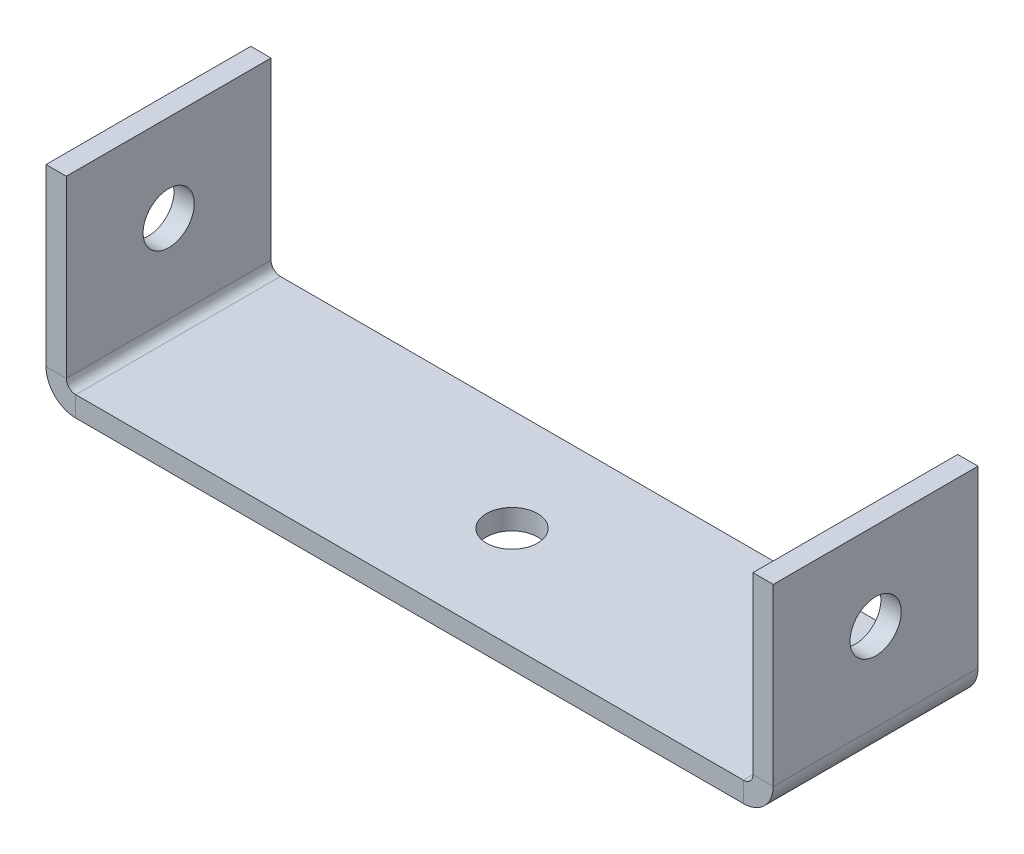
ISO-10303-21;
HEADER;
FILE_DESCRIPTION(('STEP AP214'),'2;1');
FILE_NAME('part.step','',(''),(''),'','','');
FILE_SCHEMA(('AUTOMOTIVE_DESIGN { 1 0 10303 214 1 1 1 1 }'));
ENDSEC;
DATA;
#1=APPLICATION_CONTEXT('core data for automotive mechanical design processes');
#2=APPLICATION_PROTOCOL_DEFINITION('international standard','automotive_design',2000,#1);
#3=PRODUCT_CONTEXT('',#1,'mechanical');
#4=PRODUCT('Part','Part','',(#3));
#5=PRODUCT_RELATED_PRODUCT_CATEGORY('part','',(#4));
#6=PRODUCT_DEFINITION_FORMATION('','',#4);
#7=PRODUCT_DEFINITION_CONTEXT('part definition',#1,'design');
#8=PRODUCT_DEFINITION('design','',#6,#7);
#9=PRODUCT_DEFINITION_SHAPE('','',#8);
#10=(LENGTH_UNIT() NAMED_UNIT(*) SI_UNIT(.MILLI.,.METRE.));
#11=(NAMED_UNIT(*) PLANE_ANGLE_UNIT() SI_UNIT($,.RADIAN.));
#12=(NAMED_UNIT(*) SI_UNIT($,.STERADIAN.) SOLID_ANGLE_UNIT());
#13=UNCERTAINTY_MEASURE_WITH_UNIT(LENGTH_MEASURE(1.E-05),#10,'distance_accuracy_value','');
#14=(GEOMETRIC_REPRESENTATION_CONTEXT(3) GLOBAL_UNCERTAINTY_ASSIGNED_CONTEXT((#13)) GLOBAL_UNIT_ASSIGNED_CONTEXT((#10,
#11,#12)) REPRESENTATION_CONTEXT('',''));
#15=CARTESIAN_POINT('',(0.,0.,0.));
#16=DIRECTION('',(0.,0.,1.));
#17=DIRECTION('',(1.,0.,0.));
#18=AXIS2_PLACEMENT_3D('',#15,#16,#17);
#19=CARTESIAN_POINT('',(0.,-1.5875,0.));
#20=DIRECTION('',(0.,-1.,0.));
#21=DIRECTION('',(0.,0.,-1.));
#22=AXIS2_PLACEMENT_3D('',#19,#20,#21);
#23=PLANE('',#22);
#24=CARTESIAN_POINT('',(28.415,-1.5875,-8.));
#25=DIRECTION('',(0.,1.,0.));
#26=DIRECTION('',(0.,0.,1.));
#27=AXIS2_PLACEMENT_3D('',#24,#25,#26);
#28=CIRCLE('',#27,2.);
#29=CARTESIAN_POINT('',(28.415,-1.5875,-6.));
#30=VERTEX_POINT('',#29);
#31=EDGE_CURVE('E287',#30,#30,#28,.T.);
#32=ORIENTED_EDGE('',*,*,#31,.T.);
#33=EDGE_LOOP('',(#32));
#34=FACE_BOUND('',#33,.T.);
#35=DIRECTION('',(1.,0.,0.));
#36=VECTOR('',#35,1.);
#37=CARTESIAN_POINT('',(0.,-1.5875,0.));
#38=LINE('',#37,#36);
#39=CARTESIAN_POINT('',(2.3241,-1.5875,0.));
#40=VERTEX_POINT('',#39);
#41=CARTESIAN_POINT('',(54.5059,-1.5875,0.));
#42=VERTEX_POINT('',#41);
#43=EDGE_CURVE('E13',#40,#42,#38,.T.);
#44=ORIENTED_EDGE('',*,*,#43,.F.);
#45=DIRECTION('',(0.,0.,1.));
#46=VECTOR('',#45,1.);
#47=CARTESIAN_POINT('',(2.3241,-1.5875,0.));
#48=LINE('',#47,#46);
#49=CARTESIAN_POINT('',(2.3241,-1.5875,-16.));
#50=VERTEX_POINT('',#49);
#51=EDGE_CURVE('E216',#40,#50,#48,.F.);
#52=ORIENTED_EDGE('',*,*,#51,.T.);
#53=DIRECTION('',(-1.,0.,0.));
#54=VECTOR('',#53,1.);
#55=CARTESIAN_POINT('',(0.,-1.5875,-16.));
#56=LINE('',#55,#54);
#57=CARTESIAN_POINT('',(54.5059,-1.5875,-16.));
#58=VERTEX_POINT('',#57);
#59=EDGE_CURVE('E92',#58,#50,#56,.T.);
#60=ORIENTED_EDGE('',*,*,#59,.F.);
#61=DIRECTION('',(0.,0.,-1.));
#62=VECTOR('',#61,1.);
#63=CARTESIAN_POINT('',(54.5059,-1.5875,-16.));
#64=LINE('',#63,#62);
#65=EDGE_CURVE('E267',#58,#42,#64,.F.);
#66=ORIENTED_EDGE('',*,*,#65,.T.);
#67=EDGE_LOOP('',(#44,#52,#60,#66));
#68=FACE_BOUND('',#67,.T.);
#69=ADVANCED_FACE('F83',(#34,#68),#23,.T.);
#70=CARTESIAN_POINT('',(0.,0.,0.));
#71=DIRECTION('',(0.,-1.,0.));
#72=DIRECTION('',(0.,0.,-1.));
#73=AXIS2_PLACEMENT_3D('',#70,#71,#72);
#74=PLANE('',#73);
#75=CARTESIAN_POINT('',(28.415,0.,-8.));
#76=DIRECTION('',(0.,1.,0.));
#77=DIRECTION('',(0.,0.,1.));
#78=AXIS2_PLACEMENT_3D('',#75,#76,#77);
#79=CIRCLE('',#78,2.);
#80=CARTESIAN_POINT('',(28.415,0.,-6.));
#81=VERTEX_POINT('',#80);
#82=EDGE_CURVE('E284',#81,#81,#79,.T.);
#83=ORIENTED_EDGE('',*,*,#82,.F.);
#84=EDGE_LOOP('',(#83));
#85=FACE_BOUND('',#84,.T.);
#86=DIRECTION('',(0.,0.,1.));
#87=VECTOR('',#86,1.);
#88=CARTESIAN_POINT('',(2.3241,0.,0.));
#89=LINE('',#88,#87);
#90=CARTESIAN_POINT('',(2.3241,0.,0.));
#91=VERTEX_POINT('',#90);
#92=CARTESIAN_POINT('',(2.3241,0.,-16.));
#93=VERTEX_POINT('',#92);
#94=EDGE_CURVE('E227',#91,#93,#89,.F.);
#95=ORIENTED_EDGE('',*,*,#94,.F.);
#96=DIRECTION('',(1.,0.,0.));
#97=VECTOR('',#96,1.);
#98=CARTESIAN_POINT('',(0.,0.,0.));
#99=LINE('',#98,#97);
#100=CARTESIAN_POINT('',(54.5059,0.,0.));
#101=VERTEX_POINT('',#100);
#102=EDGE_CURVE('E294',#91,#101,#99,.T.);
#103=ORIENTED_EDGE('',*,*,#102,.T.);
#104=DIRECTION('',(0.,0.,-1.));
#105=VECTOR('',#104,1.);
#106=CARTESIAN_POINT('',(54.5059,0.,-16.));
#107=LINE('',#106,#105);
#108=CARTESIAN_POINT('',(54.5059,0.,-16.));
#109=VERTEX_POINT('',#108);
#110=EDGE_CURVE('E278',#109,#101,#107,.F.);
#111=ORIENTED_EDGE('',*,*,#110,.F.);
#112=DIRECTION('',(-1.,0.,0.));
#113=VECTOR('',#112,1.);
#114=CARTESIAN_POINT('',(0.,0.,-16.));
#115=LINE('',#114,#113);
#116=EDGE_CURVE('E290',#109,#93,#115,.T.);
#117=ORIENTED_EDGE('',*,*,#116,.T.);
#118=EDGE_LOOP('',(#95,#103,#111,#117));
#119=FACE_BOUND('',#118,.T.);
#120=ADVANCED_FACE('F303',(#85,#119),#74,.F.);
#121=CARTESIAN_POINT('',(0.,-1.5875,0.));
#122=DIRECTION('',(0.,0.,1.));
#123=DIRECTION('',(1.,0.,0.));
#124=AXIS2_PLACEMENT_3D('',#121,#122,#123);
#125=PLANE('',#124);
#126=ORIENTED_EDGE('',*,*,#102,.F.);
#127=DIRECTION('',(0.,-1.,0.));
#128=VECTOR('',#127,1.);
#129=CARTESIAN_POINT('',(2.3241,0.,0.));
#130=LINE('',#129,#128);
#131=EDGE_CURVE('E221',#91,#40,#130,.T.);
#132=ORIENTED_EDGE('',*,*,#131,.T.);
#133=ORIENTED_EDGE('',*,*,#43,.T.);
#134=DIRECTION('',(0.,-1.,0.));
#135=VECTOR('',#134,1.);
#136=CARTESIAN_POINT('',(54.5059,0.,0.));
#137=LINE('',#136,#135);
#138=EDGE_CURVE('E282',#101,#42,#137,.T.);
#139=ORIENTED_EDGE('',*,*,#138,.F.);
#140=EDGE_LOOP('',(#126,#132,#133,#139));
#141=FACE_BOUND('',#140,.T.);
#142=ADVANCED_FACE('F306',(#141),#125,.T.);
#143=CARTESIAN_POINT('',(0.,-1.5875,-16.));
#144=DIRECTION('',(0.,0.,-1.));
#145=DIRECTION('',(-1.,0.,0.));
#146=AXIS2_PLACEMENT_3D('',#143,#144,#145);
#147=PLANE('',#146);
#148=DIRECTION('',(0.,-1.,0.));
#149=VECTOR('',#148,1.);
#150=CARTESIAN_POINT('',(2.3241,0.,-16.));
#151=LINE('',#150,#149);
#152=EDGE_CURVE('E232',#93,#50,#151,.T.);
#153=ORIENTED_EDGE('',*,*,#152,.F.);
#154=ORIENTED_EDGE('',*,*,#116,.F.);
#155=DIRECTION('',(0.,-1.,0.));
#156=VECTOR('',#155,1.);
#157=CARTESIAN_POINT('',(54.5059,0.,-16.));
#158=LINE('',#157,#156);
#159=EDGE_CURVE('E272',#109,#58,#158,.T.);
#160=ORIENTED_EDGE('',*,*,#159,.T.);
#161=ORIENTED_EDGE('',*,*,#59,.T.);
#162=EDGE_LOOP('',(#153,#154,#160,#161));
#163=FACE_BOUND('',#162,.T.);
#164=ADVANCED_FACE('F85',(#163),#147,.T.);
#165=CARTESIAN_POINT('',(28.415,-1.5875,-8.));
#166=DIRECTION('',(0.,1.,0.));
#167=DIRECTION('',(0.,0.,1.));
#168=AXIS2_PLACEMENT_3D('',#165,#166,#167);
#169=CYLINDRICAL_SURFACE('',#168,2.);
#170=ORIENTED_EDGE('',*,*,#31,.F.);
#171=EDGE_LOOP('',(#170));
#172=FACE_BOUND('',#171,.T.);
#173=ORIENTED_EDGE('',*,*,#82,.T.);
#174=EDGE_LOOP('',(#173));
#175=FACE_BOUND('',#174,.T.);
#176=ADVANCED_FACE('F391',(#172,#175),#169,.F.);
#177=CARTESIAN_POINT('',(54.5059,0.736599999999999,0.));
#178=DIRECTION('',(0.,0.,1.));
#179=DIRECTION('',(1.,0.,0.));
#180=AXIS2_PLACEMENT_3D('',#177,#178,#179);
#181=PLANE('',#180);
#182=DIRECTION('',(-1.,0.,0.));
#183=VECTOR('',#182,1.);
#184=CARTESIAN_POINT('',(56.83,0.736599999999992,0.));
#185=LINE('',#184,#183);
#186=CARTESIAN_POINT('',(55.2425,0.736599999999997,0.));
#187=VERTEX_POINT('',#186);
#188=CARTESIAN_POINT('',(56.83,0.736599999999992,0.));
#189=VERTEX_POINT('',#188);
#190=EDGE_CURVE('E234',#187,#189,#185,.F.);
#191=ORIENTED_EDGE('',*,*,#190,.F.);
#192=CARTESIAN_POINT('',(54.5059,0.736599999999999,0.));
#193=DIRECTION('',(0.,0.,-1.));
#194=DIRECTION('',(-1.,0.,0.));
#195=AXIS2_PLACEMENT_3D('',#192,#193,#194);
#196=CIRCLE('',#195,0.736599999999997);
#197=EDGE_CURVE('E275',#101,#187,#196,.F.);
#198=ORIENTED_EDGE('',*,*,#197,.F.);
#199=ORIENTED_EDGE('',*,*,#138,.T.);
#200=CARTESIAN_POINT('',(54.5059,0.736599999999999,0.));
#201=DIRECTION('',(0.,0.,-1.));
#202=DIRECTION('',(-1.,0.,0.));
#203=AXIS2_PLACEMENT_3D('',#200,#201,#202);
#204=CIRCLE('',#203,2.3241);
#205=EDGE_CURVE('E100',#42,#189,#204,.F.);
#206=ORIENTED_EDGE('',*,*,#205,.T.);
#207=EDGE_LOOP('',(#191,#198,#199,#206));
#208=FACE_BOUND('',#207,.T.);
#209=ADVANCED_FACE('F310',(#208),#181,.T.);
#210=CARTESIAN_POINT('',(54.5059,0.736599999999999,-16.));
#211=DIRECTION('',(0.,0.,1.));
#212=DIRECTION('',(1.,0.,0.));
#213=AXIS2_PLACEMENT_3D('',#210,#211,#212);
#214=PLANE('',#213);
#215=CARTESIAN_POINT('',(54.5059,0.736599999999999,-16.));
#216=DIRECTION('',(0.,0.,-1.));
#217=DIRECTION('',(-1.,0.,0.));
#218=AXIS2_PLACEMENT_3D('',#215,#216,#217);
#219=CIRCLE('',#218,0.736599999999997);
#220=CARTESIAN_POINT('',(55.2425,0.736599999999997,-16.));
#221=VERTEX_POINT('',#220);
#222=EDGE_CURVE('E240',#221,#109,#219,.T.);
#223=ORIENTED_EDGE('',*,*,#222,.F.);
#224=DIRECTION('',(-1.,0.,0.));
#225=VECTOR('',#224,1.);
#226=CARTESIAN_POINT('',(55.2425,0.736599999999997,-16.));
#227=LINE('',#226,#225);
#228=CARTESIAN_POINT('',(56.83,0.736599999999992,-16.));
#229=VERTEX_POINT('',#228);
#230=EDGE_CURVE('E260',#221,#229,#227,.F.);
#231=ORIENTED_EDGE('',*,*,#230,.T.);
#232=CARTESIAN_POINT('',(54.5059,0.736599999999999,-16.));
#233=DIRECTION('',(0.,0.,-1.));
#234=DIRECTION('',(-1.,0.,0.));
#235=AXIS2_PLACEMENT_3D('',#232,#233,#234);
#236=CIRCLE('',#235,2.3241);
#237=EDGE_CURVE('E270',#229,#58,#236,.T.);
#238=ORIENTED_EDGE('',*,*,#237,.T.);
#239=ORIENTED_EDGE('',*,*,#159,.F.);
#240=EDGE_LOOP('',(#223,#231,#238,#239));
#241=FACE_BOUND('',#240,.T.);
#242=ADVANCED_FACE('F334',(#241),#214,.F.);
#243=CARTESIAN_POINT('',(54.5059,0.736599999999999,-16.));
#244=DIRECTION('',(0.,0.,-1.));
#245=DIRECTION('',(1.,0.,0.));
#246=AXIS2_PLACEMENT_3D('',#243,#244,#245);
#247=CYLINDRICAL_SURFACE('',#246,2.3241);
#248=ORIENTED_EDGE('',*,*,#65,.F.);
#249=ORIENTED_EDGE('',*,*,#237,.F.);
#250=DIRECTION('',(0.,0.,-1.));
#251=VECTOR('',#250,1.);
#252=CARTESIAN_POINT('',(56.83,0.736599999999992,0.));
#253=LINE('',#252,#251);
#254=EDGE_CURVE('E258',#229,#189,#253,.F.);
#255=ORIENTED_EDGE('',*,*,#254,.T.);
#256=ORIENTED_EDGE('',*,*,#205,.F.);
#257=EDGE_LOOP('',(#248,#249,#255,#256));
#258=FACE_BOUND('',#257,.T.);
#259=ADVANCED_FACE('F337',(#258),#247,.T.);
#260=CARTESIAN_POINT('',(54.5059,0.736599999999999,-16.));
#261=DIRECTION('',(0.,0.,-1.));
#262=DIRECTION('',(1.,0.,0.));
#263=AXIS2_PLACEMENT_3D('',#260,#261,#262);
#264=CYLINDRICAL_SURFACE('',#263,0.736599999999997);
#265=ORIENTED_EDGE('',*,*,#110,.T.);
#266=ORIENTED_EDGE('',*,*,#197,.T.);
#267=DIRECTION('',(0.,0.,-1.));
#268=VECTOR('',#267,1.);
#269=CARTESIAN_POINT('',(55.2425,0.736599999999997,0.));
#270=LINE('',#269,#268);
#271=EDGE_CURVE('E263',#187,#221,#270,.T.);
#272=ORIENTED_EDGE('',*,*,#271,.T.);
#273=ORIENTED_EDGE('',*,*,#222,.T.);
#274=EDGE_LOOP('',(#265,#266,#272,#273));
#275=FACE_BOUND('',#274,.T.);
#276=ADVANCED_FACE('F313',(#275),#264,.F.);
#277=CARTESIAN_POINT('',(56.83,14.4125,-16.));
#278=DIRECTION('',(0.,0.,1.));
#279=DIRECTION('',(1.,0.,0.));
#280=AXIS2_PLACEMENT_3D('',#277,#278,#279);
#281=PLANE('',#280);
#282=ORIENTED_EDGE('',*,*,#230,.F.);
#283=DIRECTION('',(0.,-1.,0.));
#284=VECTOR('',#283,1.);
#285=CARTESIAN_POINT('',(55.2425,14.4125,-16.));
#286=LINE('',#285,#284);
#287=CARTESIAN_POINT('',(55.2425,14.4125,-16.));
#288=VERTEX_POINT('',#287);
#289=EDGE_CURVE('E256',#221,#288,#286,.F.);
#290=ORIENTED_EDGE('',*,*,#289,.T.);
#291=DIRECTION('',(-1.,0.,0.));
#292=VECTOR('',#291,1.);
#293=CARTESIAN_POINT('',(56.83,14.4125,-16.));
#294=LINE('',#293,#292);
#295=CARTESIAN_POINT('',(56.83,14.4125,-16.));
#296=VERTEX_POINT('',#295);
#297=EDGE_CURVE('E237',#296,#288,#294,.T.);
#298=ORIENTED_EDGE('',*,*,#297,.F.);
#299=DIRECTION('',(0.,1.,0.));
#300=VECTOR('',#299,1.);
#301=CARTESIAN_POINT('',(56.83,-1.97068234615931E-13,-16.));
#302=LINE('',#301,#300);
#303=EDGE_CURVE('E249',#229,#296,#302,.T.);
#304=ORIENTED_EDGE('',*,*,#303,.F.);
#305=EDGE_LOOP('',(#282,#290,#298,#304));
#306=FACE_BOUND('',#305,.T.);
#307=ADVANCED_FACE('F331',(#306),#281,.F.);
#308=CARTESIAN_POINT('',(56.83,0.,0.));
#309=DIRECTION('',(0.,0.,-1.));
#310=DIRECTION('',(-1.,0.,0.));
#311=AXIS2_PLACEMENT_3D('',#308,#309,#310);
#312=PLANE('',#311);
#313=ORIENTED_EDGE('',*,*,#190,.T.);
#314=DIRECTION('',(0.,-1.,0.));
#315=VECTOR('',#314,1.);
#316=CARTESIAN_POINT('',(56.83,-1.97068234615931E-13,0.));
#317=LINE('',#316,#315);
#318=CARTESIAN_POINT('',(56.83,14.4125,0.));
#319=VERTEX_POINT('',#318);
#320=EDGE_CURVE('E244',#319,#189,#317,.T.);
#321=ORIENTED_EDGE('',*,*,#320,.F.);
#322=DIRECTION('',(-1.,0.,0.));
#323=VECTOR('',#322,1.);
#324=CARTESIAN_POINT('',(56.83,14.4125,0.));
#325=LINE('',#324,#323);
#326=CARTESIAN_POINT('',(55.2425,14.4125,0.));
#327=VERTEX_POINT('',#326);
#328=EDGE_CURVE('E241',#319,#327,#325,.T.);
#329=ORIENTED_EDGE('',*,*,#328,.T.);
#330=DIRECTION('',(0.,1.,0.));
#331=VECTOR('',#330,1.);
#332=CARTESIAN_POINT('',(55.2425,0.,0.));
#333=LINE('',#332,#331);
#334=EDGE_CURVE('E251',#327,#187,#333,.F.);
#335=ORIENTED_EDGE('',*,*,#334,.T.);
#336=EDGE_LOOP('',(#313,#321,#329,#335));
#337=FACE_BOUND('',#336,.T.);
#338=ADVANCED_FACE('F321',(#337),#312,.F.);
#339=CARTESIAN_POINT('',(56.83,-1.97068234615931E-13,0.));
#340=DIRECTION('',(-1.,0.,0.));
#341=DIRECTION('',(0.,-1.,0.));
#342=AXIS2_PLACEMENT_3D('',#339,#340,#341);
#343=PLANE('',#342);
#344=CARTESIAN_POINT('',(56.83,7.57455,-8.));
#345=DIRECTION('',(1.,0.,0.));
#346=DIRECTION('',(0.,1.,0.));
#347=AXIS2_PLACEMENT_3D('',#344,#345,#346);
#348=CIRCLE('',#347,2.);
#349=CARTESIAN_POINT('',(56.83,9.57455,-8.));
#350=VERTEX_POINT('',#349);
#351=EDGE_CURVE('E359',#350,#350,#348,.T.);
#352=ORIENTED_EDGE('',*,*,#351,.F.);
#353=EDGE_LOOP('',(#352));
#354=FACE_BOUND('',#353,.T.);
#355=ORIENTED_EDGE('',*,*,#254,.F.);
#356=ORIENTED_EDGE('',*,*,#303,.T.);
#357=DIRECTION('',(0.,0.,1.));
#358=VECTOR('',#357,1.);
#359=CARTESIAN_POINT('',(56.83,14.4125,0.));
#360=LINE('',#359,#358);
#361=EDGE_CURVE('E247',#296,#319,#360,.T.);
#362=ORIENTED_EDGE('',*,*,#361,.T.);
#363=ORIENTED_EDGE('',*,*,#320,.T.);
#364=EDGE_LOOP('',(#355,#356,#362,#363));
#365=FACE_BOUND('',#364,.T.);
#366=ADVANCED_FACE('F336',(#354,#365),#343,.F.);
#367=CARTESIAN_POINT('',(55.2425,-1.91525507990517E-13,0.));
#368=DIRECTION('',(-1.,0.,0.));
#369=DIRECTION('',(0.,-1.,0.));
#370=AXIS2_PLACEMENT_3D('',#367,#368,#369);
#371=PLANE('',#370);
#372=CARTESIAN_POINT('',(55.2425,7.57455,-8.));
#373=DIRECTION('',(-1.,0.,0.));
#374=DIRECTION('',(0.,-1.,0.));
#375=AXIS2_PLACEMENT_3D('',#372,#373,#374);
#376=CIRCLE('',#375,2.);
#377=CARTESIAN_POINT('',(55.2425,5.57455,-8.));
#378=VERTEX_POINT('',#377);
#379=EDGE_CURVE('E215',#378,#378,#376,.T.);
#380=ORIENTED_EDGE('',*,*,#379,.F.);
#381=EDGE_LOOP('',(#380));
#382=FACE_BOUND('',#381,.T.);
#383=ORIENTED_EDGE('',*,*,#289,.F.);
#384=ORIENTED_EDGE('',*,*,#271,.F.);
#385=ORIENTED_EDGE('',*,*,#334,.F.);
#386=DIRECTION('',(0.,0.,-1.));
#387=VECTOR('',#386,1.);
#388=CARTESIAN_POINT('',(55.2425,14.4125,0.));
#389=LINE('',#388,#387);
#390=EDGE_CURVE('E254',#288,#327,#389,.F.);
#391=ORIENTED_EDGE('',*,*,#390,.F.);
#392=EDGE_LOOP('',(#383,#384,#385,#391));
#393=FACE_BOUND('',#392,.T.);
#394=ADVANCED_FACE('F318',(#382,#393),#371,.T.);
#395=CARTESIAN_POINT('',(56.83,14.4125,0.));
#396=DIRECTION('',(0.,-1.,0.));
#397=DIRECTION('',(1.,0.,0.));
#398=AXIS2_PLACEMENT_3D('',#395,#396,#397);
#399=PLANE('',#398);
#400=ORIENTED_EDGE('',*,*,#390,.T.);
#401=ORIENTED_EDGE('',*,*,#328,.F.);
#402=ORIENTED_EDGE('',*,*,#361,.F.);
#403=ORIENTED_EDGE('',*,*,#297,.T.);
#404=EDGE_LOOP('',(#400,#401,#402,#403));
#405=FACE_BOUND('',#404,.T.);
#406=ADVANCED_FACE('F326',(#405),#399,.F.);
#407=CARTESIAN_POINT('',(2.3241,0.7366,-16.));
#408=DIRECTION('',(0.,0.,-1.));
#409=DIRECTION('',(-1.,0.,0.));
#410=AXIS2_PLACEMENT_3D('',#407,#408,#409);
#411=PLANE('',#410);
#412=DIRECTION('',(1.,0.,0.));
#413=VECTOR('',#412,1.);
#414=CARTESIAN_POINT('',(0.,0.736599999999992,-16.));
#415=LINE('',#414,#413);
#416=CARTESIAN_POINT('',(1.5875,0.736599999999997,-16.));
#417=VERTEX_POINT('',#416);
#418=CARTESIAN_POINT('',(0.,0.736599999999992,-16.));
#419=VERTEX_POINT('',#418);
#420=EDGE_CURVE('E198',#417,#419,#415,.F.);
#421=ORIENTED_EDGE('',*,*,#420,.F.);
#422=CARTESIAN_POINT('',(2.3241,0.7366,-16.));
#423=DIRECTION('',(0.,0.,1.));
#424=DIRECTION('',(1.,0.,0.));
#425=AXIS2_PLACEMENT_3D('',#422,#423,#424);
#426=CIRCLE('',#425,0.7366);
#427=EDGE_CURVE('E224',#93,#417,#426,.F.);
#428=ORIENTED_EDGE('',*,*,#427,.F.);
#429=ORIENTED_EDGE('',*,*,#152,.T.);
#430=CARTESIAN_POINT('',(2.3241,0.7366,-16.));
#431=DIRECTION('',(0.,0.,1.));
#432=DIRECTION('',(1.,0.,0.));
#433=AXIS2_PLACEMENT_3D('',#430,#431,#432);
#434=CIRCLE('',#433,2.3241);
#435=EDGE_CURVE('E108',#50,#419,#434,.F.);
#436=ORIENTED_EDGE('',*,*,#435,.T.);
#437=EDGE_LOOP('',(#421,#428,#429,#436));
#438=FACE_BOUND('',#437,.T.);
#439=ADVANCED_FACE('F344',(#438),#411,.T.);
#440=CARTESIAN_POINT('',(2.3241,0.7366,0.));
#441=DIRECTION('',(0.,0.,-1.));
#442=DIRECTION('',(-1.,0.,0.));
#443=AXIS2_PLACEMENT_3D('',#440,#441,#442);
#444=PLANE('',#443);
#445=CARTESIAN_POINT('',(2.3241,0.7366,0.));
#446=DIRECTION('',(0.,0.,1.));
#447=DIRECTION('',(1.,0.,0.));
#448=AXIS2_PLACEMENT_3D('',#445,#446,#447);
#449=CIRCLE('',#448,0.7366);
#450=CARTESIAN_POINT('',(1.5875,0.736599999999997,0.));
#451=VERTEX_POINT('',#450);
#452=EDGE_CURVE('E229',#451,#91,#449,.T.);
#453=ORIENTED_EDGE('',*,*,#452,.F.);
#454=DIRECTION('',(1.,0.,0.));
#455=VECTOR('',#454,1.);
#456=CARTESIAN_POINT('',(1.5875,0.736599999999997,0.));
#457=LINE('',#456,#455);
#458=CARTESIAN_POINT('',(0.,0.736599999999992,0.));
#459=VERTEX_POINT('',#458);
#460=EDGE_CURVE('E209',#451,#459,#457,.F.);
#461=ORIENTED_EDGE('',*,*,#460,.T.);
#462=CARTESIAN_POINT('',(2.3241,0.7366,0.));
#463=DIRECTION('',(0.,0.,1.));
#464=DIRECTION('',(1.,0.,0.));
#465=AXIS2_PLACEMENT_3D('',#462,#463,#464);
#466=CIRCLE('',#465,2.3241);
#467=EDGE_CURVE('E219',#459,#40,#466,.T.);
#468=ORIENTED_EDGE('',*,*,#467,.T.);
#469=ORIENTED_EDGE('',*,*,#131,.F.);
#470=EDGE_LOOP('',(#453,#461,#468,#469));
#471=FACE_BOUND('',#470,.T.);
#472=ADVANCED_FACE('F427',(#471),#444,.F.);
#473=CARTESIAN_POINT('',(2.3241,0.7366,0.));
#474=DIRECTION('',(0.,0.,1.));
#475=DIRECTION('',(-1.,0.,0.));
#476=AXIS2_PLACEMENT_3D('',#473,#474,#475);
#477=CYLINDRICAL_SURFACE('',#476,2.3241);
#478=ORIENTED_EDGE('',*,*,#51,.F.);
#479=ORIENTED_EDGE('',*,*,#467,.F.);
#480=DIRECTION('',(0.,0.,1.));
#481=VECTOR('',#480,1.);
#482=CARTESIAN_POINT('',(0.,0.736599999999992,-16.));
#483=LINE('',#482,#481);
#484=EDGE_CURVE('E207',#459,#419,#483,.F.);
#485=ORIENTED_EDGE('',*,*,#484,.T.);
#486=ORIENTED_EDGE('',*,*,#435,.F.);
#487=EDGE_LOOP('',(#478,#479,#485,#486));
#488=FACE_BOUND('',#487,.T.);
#489=ADVANCED_FACE('F430',(#488),#477,.T.);
#490=CARTESIAN_POINT('',(2.3241,0.7366,0.));
#491=DIRECTION('',(0.,0.,1.));
#492=DIRECTION('',(-1.,0.,0.));
#493=AXIS2_PLACEMENT_3D('',#490,#491,#492);
#494=CYLINDRICAL_SURFACE('',#493,0.7366);
#495=ORIENTED_EDGE('',*,*,#94,.T.);
#496=ORIENTED_EDGE('',*,*,#427,.T.);
#497=DIRECTION('',(0.,0.,1.));
#498=VECTOR('',#497,1.);
#499=CARTESIAN_POINT('',(1.5875,0.736599999999997,-16.));
#500=LINE('',#499,#498);
#501=EDGE_CURVE('E212',#417,#451,#500,.T.);
#502=ORIENTED_EDGE('',*,*,#501,.T.);
#503=ORIENTED_EDGE('',*,*,#452,.T.);
#504=EDGE_LOOP('',(#495,#496,#502,#503));
#505=FACE_BOUND('',#504,.T.);
#506=ADVANCED_FACE('F347',(#505),#494,.F.);
#507=CARTESIAN_POINT('',(0.,0.,-16.));
#508=DIRECTION('',(0.,0.,1.));
#509=DIRECTION('',(1.,0.,0.));
#510=AXIS2_PLACEMENT_3D('',#507,#508,#509);
#511=PLANE('',#510);
#512=ORIENTED_EDGE('',*,*,#420,.T.);
#513=DIRECTION('',(0.,-1.,0.));
#514=VECTOR('',#513,1.);
#515=CARTESIAN_POINT('',(0.,0.,-16.));
#516=LINE('',#515,#514);
#517=CARTESIAN_POINT('',(0.,14.4125,-16.));
#518=VERTEX_POINT('',#517);
#519=EDGE_CURVE('E179',#518,#419,#516,.T.);
#520=ORIENTED_EDGE('',*,*,#519,.F.);
#521=DIRECTION('',(1.,0.,0.));
#522=VECTOR('',#521,1.);
#523=CARTESIAN_POINT('',(0.,14.4125,-16.));
#524=LINE('',#523,#522);
#525=CARTESIAN_POINT('',(1.58749999999995,14.4125,-16.));
#526=VERTEX_POINT('',#525);
#527=EDGE_CURVE('E185',#518,#526,#524,.T.);
#528=ORIENTED_EDGE('',*,*,#527,.T.);
#529=DIRECTION('',(0.,1.,0.));
#530=VECTOR('',#529,1.);
#531=CARTESIAN_POINT('',(1.5875,0.,-16.));
#532=LINE('',#531,#530);
#533=EDGE_CURVE('E205',#526,#417,#532,.F.);
#534=ORIENTED_EDGE('',*,*,#533,.T.);
#535=EDGE_LOOP('',(#512,#520,#528,#534));
#536=FACE_BOUND('',#535,.T.);
#537=ADVANCED_FACE('F197',(#536),#511,.F.);
#538=CARTESIAN_POINT('',(0.,14.4125,0.));
#539=DIRECTION('',(0.,0.,-1.));
#540=DIRECTION('',(-1.,0.,0.));
#541=AXIS2_PLACEMENT_3D('',#538,#539,#540);
#542=PLANE('',#541);
#543=ORIENTED_EDGE('',*,*,#460,.F.);
#544=DIRECTION('',(0.,-1.,0.));
#545=VECTOR('',#544,1.);
#546=CARTESIAN_POINT('',(1.58749999999995,14.4125,0.));
#547=LINE('',#546,#545);
#548=CARTESIAN_POINT('',(1.58749999999995,14.4125,0.));
#549=VERTEX_POINT('',#548);
#550=EDGE_CURVE('E201',#451,#549,#547,.F.);
#551=ORIENTED_EDGE('',*,*,#550,.T.);
#552=DIRECTION('',(1.,0.,0.));
#553=VECTOR('',#552,1.);
#554=CARTESIAN_POINT('',(0.,14.4125,0.));
#555=LINE('',#554,#553);
#556=CARTESIAN_POINT('',(0.,14.4125,0.));
#557=VERTEX_POINT('',#556);
#558=EDGE_CURVE('E194',#557,#549,#555,.T.);
#559=ORIENTED_EDGE('',*,*,#558,.F.);
#560=DIRECTION('',(0.,1.,0.));
#561=VECTOR('',#560,1.);
#562=CARTESIAN_POINT('',(0.,0.,0.));
#563=LINE('',#562,#561);
#564=EDGE_CURVE('E181',#459,#557,#563,.T.);
#565=ORIENTED_EDGE('',*,*,#564,.F.);
#566=EDGE_LOOP('',(#543,#551,#559,#565));
#567=FACE_BOUND('',#566,.T.);
#568=ADVANCED_FACE('F354',(#567),#542,.F.);
#569=CARTESIAN_POINT('',(0.,0.,0.));
#570=DIRECTION('',(1.,0.,0.));
#571=DIRECTION('',(0.,1.,0.));
#572=AXIS2_PLACEMENT_3D('',#569,#570,#571);
#573=PLANE('',#572);
#574=CARTESIAN_POINT('',(0.,7.57455000000019,-8.));
#575=DIRECTION('',(1.,0.,0.));
#576=DIRECTION('',(0.,1.,0.));
#577=AXIS2_PLACEMENT_3D('',#574,#575,#576);
#578=CIRCLE('',#577,2.);
#579=CARTESIAN_POINT('',(0.,9.57455000000019,-8.));
#580=VERTEX_POINT('',#579);
#581=EDGE_CURVE('E362',#580,#580,#578,.T.);
#582=ORIENTED_EDGE('',*,*,#581,.T.);
#583=EDGE_LOOP('',(#582));
#584=FACE_BOUND('',#583,.T.);
#585=ORIENTED_EDGE('',*,*,#484,.F.);
#586=ORIENTED_EDGE('',*,*,#564,.T.);
#587=DIRECTION('',(0.,0.,-1.));
#588=VECTOR('',#587,1.);
#589=CARTESIAN_POINT('',(0.,14.4125,0.));
#590=LINE('',#589,#588);
#591=EDGE_CURVE('E174',#557,#518,#590,.T.);
#592=ORIENTED_EDGE('',*,*,#591,.T.);
#593=ORIENTED_EDGE('',*,*,#519,.T.);
#594=EDGE_LOOP('',(#585,#586,#592,#593));
#595=FACE_BOUND('',#594,.T.);
#596=ADVANCED_FACE('F177',(#584,#595),#573,.F.);
#597=CARTESIAN_POINT('',(1.5875,0.,0.));
#598=DIRECTION('',(1.,0.,0.));
#599=DIRECTION('',(0.,1.,0.));
#600=AXIS2_PLACEMENT_3D('',#597,#598,#599);
#601=PLANE('',#600);
#602=CARTESIAN_POINT('',(1.58749999999997,7.57455000000018,-8.));
#603=DIRECTION('',(1.,0.,0.));
#604=DIRECTION('',(0.,1.,0.));
#605=AXIS2_PLACEMENT_3D('',#602,#603,#604);
#606=CIRCLE('',#605,2.);
#607=CARTESIAN_POINT('',(1.58749999999997,9.57455000000018,-8.));
#608=VERTEX_POINT('',#607);
#609=EDGE_CURVE('E87',#608,#608,#606,.T.);
#610=ORIENTED_EDGE('',*,*,#609,.F.);
#611=EDGE_LOOP('',(#610));
#612=FACE_BOUND('',#611,.T.);
#613=ORIENTED_EDGE('',*,*,#550,.F.);
#614=ORIENTED_EDGE('',*,*,#501,.F.);
#615=ORIENTED_EDGE('',*,*,#533,.F.);
#616=DIRECTION('',(0.,0.,1.));
#617=VECTOR('',#616,1.);
#618=CARTESIAN_POINT('',(1.58749999999995,14.4125,-16.));
#619=LINE('',#618,#617);
#620=EDGE_CURVE('E190',#549,#526,#619,.F.);
#621=ORIENTED_EDGE('',*,*,#620,.F.);
#622=EDGE_LOOP('',(#613,#614,#615,#621));
#623=FACE_BOUND('',#622,.T.);
#624=ADVANCED_FACE('F351',(#612,#623),#601,.T.);
#625=CARTESIAN_POINT('',(0.,14.4125,-16.));
#626=DIRECTION('',(0.,-1.,0.));
#627=DIRECTION('',(1.,0.,0.));
#628=AXIS2_PLACEMENT_3D('',#625,#626,#627);
#629=PLANE('',#628);
#630=ORIENTED_EDGE('',*,*,#620,.T.);
#631=ORIENTED_EDGE('',*,*,#527,.F.);
#632=ORIENTED_EDGE('',*,*,#591,.F.);
#633=ORIENTED_EDGE('',*,*,#558,.T.);
#634=EDGE_LOOP('',(#630,#631,#632,#633));
#635=FACE_BOUND('',#634,.T.);
#636=ADVANCED_FACE('F188',(#635),#629,.F.);
#637=CARTESIAN_POINT('',(0.,7.57455000000019,-8.));
#638=DIRECTION('',(1.,0.,0.));
#639=DIRECTION('',(0.,1.,0.));
#640=AXIS2_PLACEMENT_3D('',#637,#638,#639);
#641=CYLINDRICAL_SURFACE('',#640,2.);
#642=ORIENTED_EDGE('',*,*,#609,.T.);
#643=EDGE_LOOP('',(#642));
#644=FACE_BOUND('',#643,.T.);
#645=ORIENTED_EDGE('',*,*,#581,.F.);
#646=EDGE_LOOP('',(#645));
#647=FACE_BOUND('',#646,.T.);
#648=ADVANCED_FACE('F369',(#644,#647),#641,.F.);
#649=ORIENTED_EDGE('',*,*,#379,.T.);
#650=EDGE_LOOP('',(#649));
#651=FACE_BOUND('',#650,.T.);
#652=ORIENTED_EDGE('',*,*,#351,.T.);
#653=EDGE_LOOP('',(#652));
#654=FACE_BOUND('',#653,.T.);
#655=ADVANCED_FACE('F486',(#651,#654),#641,.F.);
#656=CLOSED_SHELL('',(#69,#120,#142,#164,#176,#209,#242,#259,#276,#307,#338,#366,#394,#406,#439,
#472,#489,#506,#537,#568,#596,#624,#636,#648,#655));
#657=MANIFOLD_SOLID_BREP('B2',#656);
#658=ADVANCED_BREP_SHAPE_REPRESENTATION('',(#18,#657),#14);
#659=SHAPE_DEFINITION_REPRESENTATION(#9,#658);
ENDSEC;
END-ISO-10303-21;
